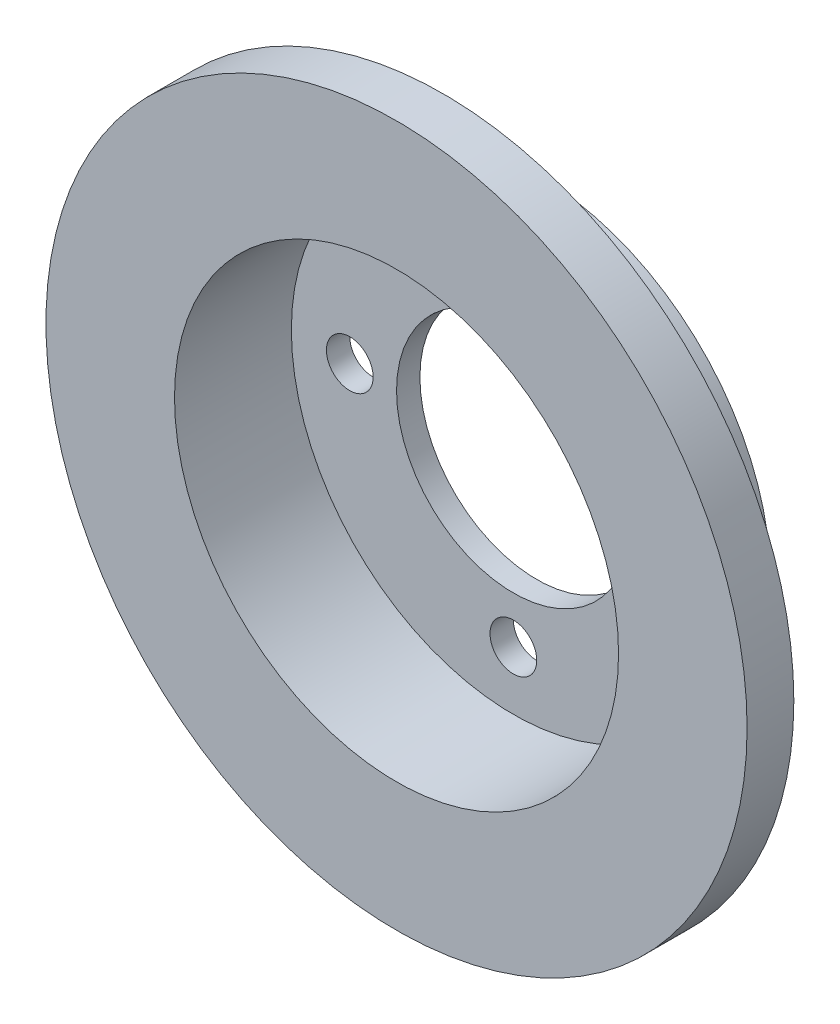
ISO-10303-21;
HEADER;
FILE_DESCRIPTION(('STEP AP214'),'2;1');
FILE_NAME('part.step','',(''),(''),'','','');
FILE_SCHEMA(('AUTOMOTIVE_DESIGN { 1 0 10303 214 1 1 1 1 }'));
ENDSEC;
DATA;
#1=APPLICATION_CONTEXT('core data for automotive mechanical design processes');
#2=APPLICATION_PROTOCOL_DEFINITION('international standard','automotive_design',2000,#1);
#3=PRODUCT_CONTEXT('',#1,'mechanical');
#4=PRODUCT('Part','Part','',(#3));
#5=PRODUCT_RELATED_PRODUCT_CATEGORY('part','',(#4));
#6=PRODUCT_DEFINITION_FORMATION('','',#4);
#7=PRODUCT_DEFINITION_CONTEXT('part definition',#1,'design');
#8=PRODUCT_DEFINITION('design','',#6,#7);
#9=PRODUCT_DEFINITION_SHAPE('','',#8);
#10=(LENGTH_UNIT() NAMED_UNIT(*) SI_UNIT(.MILLI.,.METRE.));
#11=(NAMED_UNIT(*) PLANE_ANGLE_UNIT() SI_UNIT($,.RADIAN.));
#12=(NAMED_UNIT(*) SI_UNIT($,.STERADIAN.) SOLID_ANGLE_UNIT());
#13=UNCERTAINTY_MEASURE_WITH_UNIT(LENGTH_MEASURE(1.E-05),#10,'distance_accuracy_value','');
#14=(GEOMETRIC_REPRESENTATION_CONTEXT(3) GLOBAL_UNCERTAINTY_ASSIGNED_CONTEXT((#13)) GLOBAL_UNIT_ASSIGNED_CONTEXT((#10,
#11,#12)) REPRESENTATION_CONTEXT('',''));
#15=CARTESIAN_POINT('',(0.,0.,0.));
#16=DIRECTION('',(0.,0.,1.));
#17=DIRECTION('',(1.,0.,0.));
#18=AXIS2_PLACEMENT_3D('',#15,#16,#17);
#19=CARTESIAN_POINT('',(0.,0.,20.));
#20=DIRECTION('',(0.,0.,-1.));
#21=DIRECTION('',(-1.,0.,0.));
#22=AXIS2_PLACEMENT_3D('',#19,#20,#21);
#23=CYLINDRICAL_SURFACE('',#22,50.);
#24=CARTESIAN_POINT('',(0.,0.,20.));
#25=DIRECTION('',(0.,0.,1.));
#26=DIRECTION('',(1.,0.,0.));
#27=AXIS2_PLACEMENT_3D('',#24,#25,#26);
#28=CIRCLE('',#27,50.);
#29=CARTESIAN_POINT('',(50.,0.,20.));
#30=VERTEX_POINT('',#29);
#31=EDGE_CURVE('E10',#30,#30,#28,.T.);
#32=ORIENTED_EDGE('',*,*,#31,.F.);
#33=EDGE_LOOP('',(#32));
#34=FACE_BOUND('',#33,.T.);
#35=CARTESIAN_POINT('',(0.,0.,0.));
#36=DIRECTION('',(0.,0.,1.));
#37=DIRECTION('',(1.,0.,0.));
#38=AXIS2_PLACEMENT_3D('',#35,#36,#37);
#39=CIRCLE('',#38,50.);
#40=CARTESIAN_POINT('',(50.,0.,0.));
#41=VERTEX_POINT('',#40);
#42=EDGE_CURVE('E49',#41,#41,#39,.T.);
#43=ORIENTED_EDGE('',*,*,#42,.T.);
#44=EDGE_LOOP('',(#43));
#45=FACE_BOUND('',#44,.T.);
#46=ADVANCED_FACE('F41',(#34,#45),#23,.T.);
#47=CARTESIAN_POINT('',(0.,0.,0.));
#48=DIRECTION('',(0.,0.,1.));
#49=DIRECTION('',(1.,0.,0.));
#50=AXIS2_PLACEMENT_3D('',#47,#48,#49);
#51=PLANE('',#50);
#52=CARTESIAN_POINT('',(0.,35.,0.));
#53=DIRECTION('',(0.,0.,1.));
#54=DIRECTION('',(1.,0.,0.));
#55=AXIS2_PLACEMENT_3D('',#52,#53,#54);
#56=CIRCLE('',#55,5.);
#57=CARTESIAN_POINT('',(5.,35.,0.));
#58=VERTEX_POINT('',#57);
#59=EDGE_CURVE('E76',#58,#58,#56,.T.);
#60=ORIENTED_EDGE('',*,*,#59,.T.);
#61=EDGE_LOOP('',(#60));
#62=FACE_BOUND('',#61,.T.);
#63=CARTESIAN_POINT('',(35.000000000001,9.88330434368617E-13,0.));
#64=DIRECTION('',(0.,0.,1.));
#65=DIRECTION('',(1.,0.,0.));
#66=AXIS2_PLACEMENT_3D('',#63,#64,#65);
#67=CIRCLE('',#66,5.00000000000077);
#68=CARTESIAN_POINT('',(40.0000000000018,9.88330434368617E-13,0.));
#69=VERTEX_POINT('',#68);
#70=EDGE_CURVE('E80',#69,#69,#67,.T.);
#71=ORIENTED_EDGE('',*,*,#70,.T.);
#72=EDGE_LOOP('',(#71));
#73=FACE_BOUND('',#72,.T.);
#74=CARTESIAN_POINT('',(1.97819167723617E-12,-35.,0.));
#75=DIRECTION('',(0.,0.,1.));
#76=DIRECTION('',(1.,0.,0.));
#77=AXIS2_PLACEMENT_3D('',#74,#75,#76);
#78=CIRCLE('',#77,5.00000000000213);
#79=CARTESIAN_POINT('',(5.00000000000411,-35.,0.));
#80=VERTEX_POINT('',#79);
#81=EDGE_CURVE('E84',#80,#80,#78,.T.);
#82=ORIENTED_EDGE('',*,*,#81,.T.);
#83=EDGE_LOOP('',(#82));
#84=FACE_BOUND('',#83,.T.);
#85=CARTESIAN_POINT('',(-34.999999999999,-9.92616698165633E-13,0.));
#86=DIRECTION('',(0.,0.,1.));
#87=DIRECTION('',(1.,0.,0.));
#88=AXIS2_PLACEMENT_3D('',#85,#86,#87);
#89=CIRCLE('',#88,5.00000000000159);
#90=CARTESIAN_POINT('',(-29.9999999999974,-9.92616698165633E-13,0.));
#91=VERTEX_POINT('',#90);
#92=EDGE_CURVE('E88',#91,#91,#89,.T.);
#93=ORIENTED_EDGE('',*,*,#92,.T.);
#94=EDGE_LOOP('',(#93));
#95=FACE_BOUND('',#94,.T.);
#96=CARTESIAN_POINT('',(0.,0.,0.));
#97=DIRECTION('',(0.,0.,1.));
#98=DIRECTION('',(1.,0.,0.));
#99=AXIS2_PLACEMENT_3D('',#96,#97,#98);
#100=CIRCLE('',#99,25.);
#101=CARTESIAN_POINT('',(25.,0.,0.));
#102=VERTEX_POINT('',#101);
#103=EDGE_CURVE('E44',#102,#102,#100,.T.);
#104=ORIENTED_EDGE('',*,*,#103,.T.);
#105=EDGE_LOOP('',(#104));
#106=FACE_BOUND('',#105,.T.);
#107=ORIENTED_EDGE('',*,*,#42,.F.);
#108=EDGE_LOOP('',(#107));
#109=FACE_BOUND('',#108,.T.);
#110=ADVANCED_FACE('F143',(#62,#73,#84,#95,#106,#109),#51,.F.);
#111=CARTESIAN_POINT('',(0.,0.,30.));
#112=DIRECTION('',(0.,0.,-1.));
#113=DIRECTION('',(-1.,0.,0.));
#114=AXIS2_PLACEMENT_3D('',#111,#112,#113);
#115=CYLINDRICAL_SURFACE('',#114,75.);
#116=CARTESIAN_POINT('',(0.,0.,30.));
#117=DIRECTION('',(0.,0.,1.));
#118=DIRECTION('',(1.,0.,0.));
#119=AXIS2_PLACEMENT_3D('',#116,#117,#118);
#120=CIRCLE('',#119,75.);
#121=CARTESIAN_POINT('',(75.,0.,30.));
#122=VERTEX_POINT('',#121);
#123=EDGE_CURVE('E55',#122,#122,#120,.T.);
#124=ORIENTED_EDGE('',*,*,#123,.F.);
#125=EDGE_LOOP('',(#124));
#126=FACE_BOUND('',#125,.T.);
#127=CARTESIAN_POINT('',(0.,0.,20.));
#128=DIRECTION('',(0.,0.,1.));
#129=DIRECTION('',(1.,0.,0.));
#130=AXIS2_PLACEMENT_3D('',#127,#128,#129);
#131=CIRCLE('',#130,75.);
#132=CARTESIAN_POINT('',(75.,0.,20.));
#133=VERTEX_POINT('',#132);
#134=EDGE_CURVE('E57',#133,#133,#131,.T.);
#135=ORIENTED_EDGE('',*,*,#134,.T.);
#136=EDGE_LOOP('',(#135));
#137=FACE_BOUND('',#136,.T.);
#138=ADVANCED_FACE('F137',(#126,#137),#115,.T.);
#139=CARTESIAN_POINT('',(0.,0.,30.));
#140=DIRECTION('',(0.,0.,1.));
#141=DIRECTION('',(1.,0.,0.));
#142=AXIS2_PLACEMENT_3D('',#139,#140,#141);
#143=PLANE('',#142);
#144=CARTESIAN_POINT('',(0.,0.,30.));
#145=DIRECTION('',(0.,0.,1.));
#146=DIRECTION('',(1.,0.,0.));
#147=AXIS2_PLACEMENT_3D('',#144,#145,#146);
#148=CIRCLE('',#147,47.5);
#149=CARTESIAN_POINT('',(47.5,0.,30.));
#150=VERTEX_POINT('',#149);
#151=EDGE_CURVE('E65',#150,#150,#148,.T.);
#152=ORIENTED_EDGE('',*,*,#151,.F.);
#153=EDGE_LOOP('',(#152));
#154=FACE_BOUND('',#153,.T.);
#155=ORIENTED_EDGE('',*,*,#123,.T.);
#156=EDGE_LOOP('',(#155));
#157=FACE_BOUND('',#156,.T.);
#158=ADVANCED_FACE('F134',(#154,#157),#143,.T.);
#159=CARTESIAN_POINT('',(0.,0.,20.));
#160=DIRECTION('',(0.,0.,1.));
#161=DIRECTION('',(1.,0.,0.));
#162=AXIS2_PLACEMENT_3D('',#159,#160,#161);
#163=PLANE('',#162);
#164=ORIENTED_EDGE('',*,*,#31,.T.);
#165=EDGE_LOOP('',(#164));
#166=FACE_BOUND('',#165,.T.);
#167=ORIENTED_EDGE('',*,*,#134,.F.);
#168=EDGE_LOOP('',(#167));
#169=FACE_BOUND('',#168,.T.);
#170=ADVANCED_FACE('F130',(#166,#169),#163,.F.);
#171=CARTESIAN_POINT('',(0.,0.,5.));
#172=DIRECTION('',(0.,0.,1.));
#173=DIRECTION('',(1.,0.,0.));
#174=AXIS2_PLACEMENT_3D('',#171,#172,#173);
#175=CYLINDRICAL_SURFACE('',#174,47.5);
#176=CARTESIAN_POINT('',(0.,0.,5.));
#177=DIRECTION('',(0.,0.,1.));
#178=DIRECTION('',(1.,0.,0.));
#179=AXIS2_PLACEMENT_3D('',#176,#177,#178);
#180=CIRCLE('',#179,47.5);
#181=CARTESIAN_POINT('',(47.5,0.,5.));
#182=VERTEX_POINT('',#181);
#183=EDGE_CURVE('E61',#182,#182,#180,.T.);
#184=ORIENTED_EDGE('',*,*,#183,.F.);
#185=EDGE_LOOP('',(#184));
#186=FACE_BOUND('',#185,.T.);
#187=ORIENTED_EDGE('',*,*,#151,.T.);
#188=EDGE_LOOP('',(#187));
#189=FACE_BOUND('',#188,.T.);
#190=ADVANCED_FACE('F116',(#186,#189),#175,.F.);
#191=CARTESIAN_POINT('',(0.,0.,5.));
#192=DIRECTION('',(0.,0.,1.));
#193=DIRECTION('',(1.,0.,0.));
#194=AXIS2_PLACEMENT_3D('',#191,#192,#193);
#195=PLANE('',#194);
#196=CARTESIAN_POINT('',(0.,35.,5.));
#197=DIRECTION('',(0.,0.,1.));
#198=DIRECTION('',(1.,0.,0.));
#199=AXIS2_PLACEMENT_3D('',#196,#197,#198);
#200=CIRCLE('',#199,5.);
#201=CARTESIAN_POINT('',(5.,35.,5.));
#202=VERTEX_POINT('',#201);
#203=EDGE_CURVE('E92',#202,#202,#200,.T.);
#204=ORIENTED_EDGE('',*,*,#203,.F.);
#205=EDGE_LOOP('',(#204));
#206=FACE_BOUND('',#205,.T.);
#207=CARTESIAN_POINT('',(35.000000000001,9.88330434368617E-13,5.));
#208=DIRECTION('',(0.,0.,1.));
#209=DIRECTION('',(1.,0.,0.));
#210=AXIS2_PLACEMENT_3D('',#207,#208,#209);
#211=CIRCLE('',#210,5.00000000000077);
#212=CARTESIAN_POINT('',(40.0000000000018,9.88330434368617E-13,5.));
#213=VERTEX_POINT('',#212);
#214=EDGE_CURVE('E101',#213,#213,#211,.T.);
#215=ORIENTED_EDGE('',*,*,#214,.F.);
#216=EDGE_LOOP('',(#215));
#217=FACE_BOUND('',#216,.T.);
#218=CARTESIAN_POINT('',(1.97819167723617E-12,-35.,5.));
#219=DIRECTION('',(0.,0.,1.));
#220=DIRECTION('',(1.,0.,0.));
#221=AXIS2_PLACEMENT_3D('',#218,#219,#220);
#222=CIRCLE('',#221,5.00000000000213);
#223=CARTESIAN_POINT('',(5.00000000000411,-35.,5.));
#224=VERTEX_POINT('',#223);
#225=EDGE_CURVE('E97',#224,#224,#222,.T.);
#226=ORIENTED_EDGE('',*,*,#225,.F.);
#227=EDGE_LOOP('',(#226));
#228=FACE_BOUND('',#227,.T.);
#229=CARTESIAN_POINT('',(-34.999999999999,-9.92616698165633E-13,5.));
#230=DIRECTION('',(0.,0.,1.));
#231=DIRECTION('',(1.,0.,0.));
#232=AXIS2_PLACEMENT_3D('',#229,#230,#231);
#233=CIRCLE('',#232,5.00000000000159);
#234=CARTESIAN_POINT('',(-29.9999999999974,-9.92616698165633E-13,5.));
#235=VERTEX_POINT('',#234);
#236=EDGE_CURVE('E93',#235,#235,#233,.T.);
#237=ORIENTED_EDGE('',*,*,#236,.F.);
#238=EDGE_LOOP('',(#237));
#239=FACE_BOUND('',#238,.T.);
#240=CARTESIAN_POINT('',(0.,0.,5.));
#241=DIRECTION('',(0.,0.,1.));
#242=DIRECTION('',(1.,0.,0.));
#243=AXIS2_PLACEMENT_3D('',#240,#241,#242);
#244=CIRCLE('',#243,25.);
#245=CARTESIAN_POINT('',(25.,0.,5.));
#246=VERTEX_POINT('',#245);
#247=EDGE_CURVE('E72',#246,#246,#244,.T.);
#248=ORIENTED_EDGE('',*,*,#247,.F.);
#249=EDGE_LOOP('',(#248));
#250=FACE_BOUND('',#249,.T.);
#251=ORIENTED_EDGE('',*,*,#183,.T.);
#252=EDGE_LOOP('',(#251));
#253=FACE_BOUND('',#252,.T.);
#254=ADVANCED_FACE('F112',(#206,#217,#228,#239,#250,#253),#195,.T.);
#255=CARTESIAN_POINT('',(0.,0.,-20.));
#256=DIRECTION('',(0.,0.,1.));
#257=DIRECTION('',(1.,0.,0.));
#258=AXIS2_PLACEMENT_3D('',#255,#256,#257);
#259=CYLINDRICAL_SURFACE('',#258,25.);
#260=ORIENTED_EDGE('',*,*,#247,.T.);
#261=EDGE_LOOP('',(#260));
#262=FACE_BOUND('',#261,.T.);
#263=ORIENTED_EDGE('',*,*,#103,.F.);
#264=EDGE_LOOP('',(#263));
#265=FACE_BOUND('',#264,.T.);
#266=ADVANCED_FACE('F115',(#262,#265),#259,.F.);
#267=CARTESIAN_POINT('',(-34.999999999999,-9.92616698165633E-13,-20.));
#268=DIRECTION('',(0.,0.,1.));
#269=DIRECTION('',(1.,0.,0.));
#270=AXIS2_PLACEMENT_3D('',#267,#268,#269);
#271=CYLINDRICAL_SURFACE('',#270,5.00000000000159);
#272=ORIENTED_EDGE('',*,*,#236,.T.);
#273=EDGE_LOOP('',(#272));
#274=FACE_BOUND('',#273,.T.);
#275=ORIENTED_EDGE('',*,*,#92,.F.);
#276=EDGE_LOOP('',(#275));
#277=FACE_BOUND('',#276,.T.);
#278=ADVANCED_FACE('F175',(#274,#277),#271,.F.);
#279=CARTESIAN_POINT('',(1.97819167723617E-12,-35.,-20.));
#280=DIRECTION('',(0.,0.,1.));
#281=DIRECTION('',(1.,0.,0.));
#282=AXIS2_PLACEMENT_3D('',#279,#280,#281);
#283=CYLINDRICAL_SURFACE('',#282,5.00000000000213);
#284=ORIENTED_EDGE('',*,*,#225,.T.);
#285=EDGE_LOOP('',(#284));
#286=FACE_BOUND('',#285,.T.);
#287=ORIENTED_EDGE('',*,*,#81,.F.);
#288=EDGE_LOOP('',(#287));
#289=FACE_BOUND('',#288,.T.);
#290=ADVANCED_FACE('F181',(#286,#289),#283,.F.);
#291=CARTESIAN_POINT('',(35.000000000001,9.88330434368617E-13,-20.));
#292=DIRECTION('',(0.,0.,1.));
#293=DIRECTION('',(1.,0.,0.));
#294=AXIS2_PLACEMENT_3D('',#291,#292,#293);
#295=CYLINDRICAL_SURFACE('',#294,5.00000000000077);
#296=ORIENTED_EDGE('',*,*,#214,.T.);
#297=EDGE_LOOP('',(#296));
#298=FACE_BOUND('',#297,.T.);
#299=ORIENTED_EDGE('',*,*,#70,.F.);
#300=EDGE_LOOP('',(#299));
#301=FACE_BOUND('',#300,.T.);
#302=ADVANCED_FACE('F187',(#298,#301),#295,.F.);
#303=CARTESIAN_POINT('',(0.,35.,-20.));
#304=DIRECTION('',(0.,0.,1.));
#305=DIRECTION('',(1.,0.,0.));
#306=AXIS2_PLACEMENT_3D('',#303,#304,#305);
#307=CYLINDRICAL_SURFACE('',#306,5.);
#308=ORIENTED_EDGE('',*,*,#203,.T.);
#309=EDGE_LOOP('',(#308));
#310=FACE_BOUND('',#309,.T.);
#311=ORIENTED_EDGE('',*,*,#59,.F.);
#312=EDGE_LOOP('',(#311));
#313=FACE_BOUND('',#312,.T.);
#314=ADVANCED_FACE('F109',(#310,#313),#307,.F.);
#315=CLOSED_SHELL('',(#46,#110,#138,#158,#170,#190,#254,#266,#278,#290,#302,#314));
#316=MANIFOLD_SOLID_BREP('B2',#315);
#317=ADVANCED_BREP_SHAPE_REPRESENTATION('',(#18,#316),#14);
#318=SHAPE_DEFINITION_REPRESENTATION(#9,#317);
ENDSEC;
END-ISO-10303-21;
